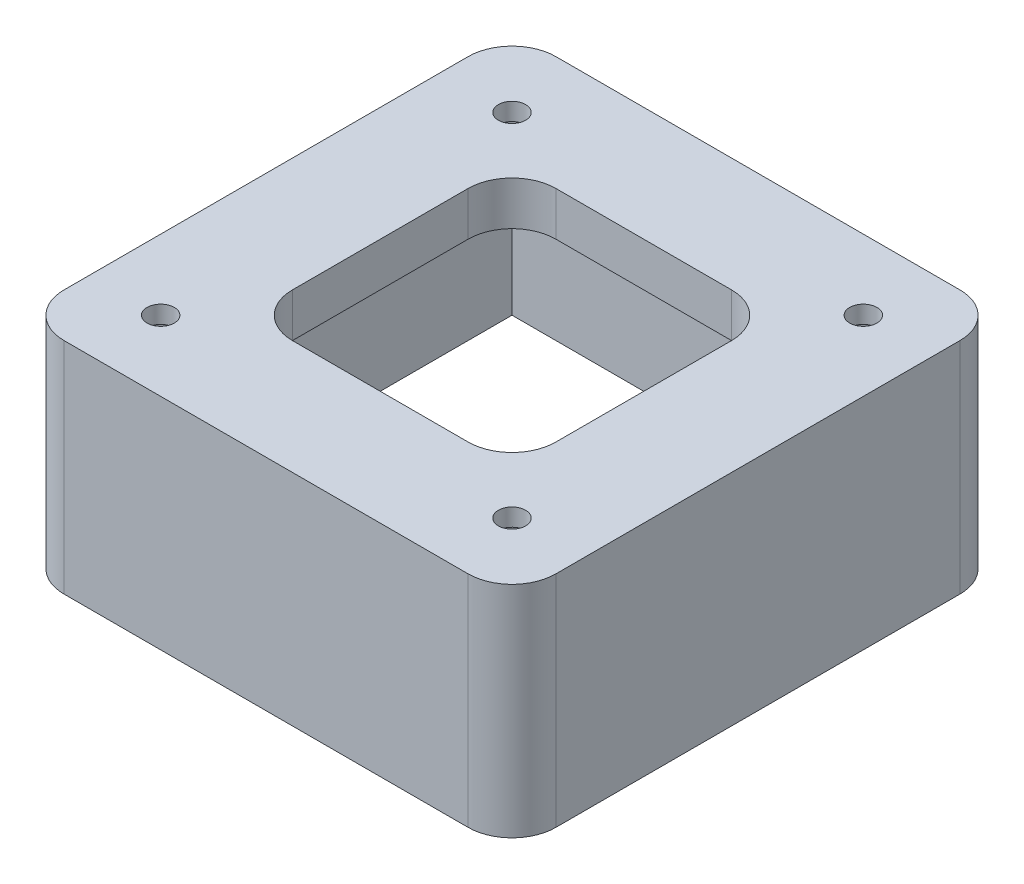
ISO-10303-21;
HEADER;
FILE_DESCRIPTION(('STEP AP214'),'2;1');
FILE_NAME('part.step','',(''),(''),'','','');
FILE_SCHEMA(('AUTOMOTIVE_DESIGN { 1 0 10303 214 1 1 1 1 }'));
ENDSEC;
DATA;
#1=APPLICATION_CONTEXT('core data for automotive mechanical design processes');
#2=APPLICATION_PROTOCOL_DEFINITION('international standard','automotive_design',2000,#1);
#3=PRODUCT_CONTEXT('',#1,'mechanical');
#4=PRODUCT('Part','Part','',(#3));
#5=PRODUCT_RELATED_PRODUCT_CATEGORY('part','',(#4));
#6=PRODUCT_DEFINITION_FORMATION('','',#4);
#7=PRODUCT_DEFINITION_CONTEXT('part definition',#1,'design');
#8=PRODUCT_DEFINITION('design','',#6,#7);
#9=PRODUCT_DEFINITION_SHAPE('','',#8);
#10=(LENGTH_UNIT() NAMED_UNIT(*) SI_UNIT(.MILLI.,.METRE.));
#11=(NAMED_UNIT(*) PLANE_ANGLE_UNIT() SI_UNIT($,.RADIAN.));
#12=(NAMED_UNIT(*) SI_UNIT($,.STERADIAN.) SOLID_ANGLE_UNIT());
#13=UNCERTAINTY_MEASURE_WITH_UNIT(LENGTH_MEASURE(1.E-05),#10,'distance_accuracy_value','');
#14=(GEOMETRIC_REPRESENTATION_CONTEXT(3) GLOBAL_UNCERTAINTY_ASSIGNED_CONTEXT((#13)) GLOBAL_UNIT_ASSIGNED_CONTEXT((#10,
#11,#12)) REPRESENTATION_CONTEXT('',''));
#15=CARTESIAN_POINT('',(0.,0.,0.));
#16=DIRECTION('',(0.,0.,1.));
#17=DIRECTION('',(1.,0.,0.));
#18=AXIS2_PLACEMENT_3D('',#15,#16,#17);
#19=CARTESIAN_POINT('',(-20.,5.,20.));
#20=DIRECTION('',(0.,-1.,0.));
#21=DIRECTION('',(0.,0.,-1.));
#22=AXIS2_PLACEMENT_3D('',#19,#20,#21);
#23=CYLINDRICAL_SURFACE('',#22,1.55);
#24=CARTESIAN_POINT('',(-20.,5.,20.));
#25=DIRECTION('',(0.,1.,0.));
#26=DIRECTION('',(0.,0.,1.));
#27=AXIS2_PLACEMENT_3D('',#24,#25,#26);
#28=CIRCLE('',#27,1.55);
#29=CARTESIAN_POINT('',(-20.,5.,21.55));
#30=VERTEX_POINT('',#29);
#31=EDGE_CURVE('E267',#30,#30,#28,.T.);
#32=ORIENTED_EDGE('',*,*,#31,.T.);
#33=EDGE_LOOP('',(#32));
#34=FACE_BOUND('',#33,.T.);
#35=CARTESIAN_POINT('',(-20.,3.,20.));
#36=DIRECTION('',(0.,-1.,0.));
#37=DIRECTION('',(0.,0.,-1.));
#38=AXIS2_PLACEMENT_3D('',#35,#36,#37);
#39=CIRCLE('',#38,1.55);
#40=CARTESIAN_POINT('',(-20.,3.,18.45));
#41=VERTEX_POINT('',#40);
#42=EDGE_CURVE('E230',#41,#41,#39,.T.);
#43=ORIENTED_EDGE('',*,*,#42,.T.);
#44=EDGE_LOOP('',(#43));
#45=FACE_BOUND('',#44,.T.);
#46=ADVANCED_FACE('F33',(#34,#45),#23,.F.);
#47=CARTESIAN_POINT('',(20.,5.,-20.));
#48=DIRECTION('',(0.,-1.,0.));
#49=DIRECTION('',(0.,0.,-1.));
#50=AXIS2_PLACEMENT_3D('',#47,#48,#49);
#51=CYLINDRICAL_SURFACE('',#50,1.55);
#52=CARTESIAN_POINT('',(20.,5.,-20.));
#53=DIRECTION('',(0.,1.,0.));
#54=DIRECTION('',(0.,0.,1.));
#55=AXIS2_PLACEMENT_3D('',#52,#53,#54);
#56=CIRCLE('',#55,1.55);
#57=CARTESIAN_POINT('',(20.,5.,-18.45));
#58=VERTEX_POINT('',#57);
#59=EDGE_CURVE('E284',#58,#58,#56,.T.);
#60=ORIENTED_EDGE('',*,*,#59,.T.);
#61=EDGE_LOOP('',(#60));
#62=FACE_BOUND('',#61,.T.);
#63=CARTESIAN_POINT('',(20.,3.,-20.));
#64=DIRECTION('',(0.,-1.,0.));
#65=DIRECTION('',(0.,0.,-1.));
#66=AXIS2_PLACEMENT_3D('',#63,#64,#65);
#67=CIRCLE('',#66,1.55);
#68=CARTESIAN_POINT('',(20.,3.,-21.55));
#69=VERTEX_POINT('',#68);
#70=EDGE_CURVE('E236',#69,#69,#67,.T.);
#71=ORIENTED_EDGE('',*,*,#70,.T.);
#72=EDGE_LOOP('',(#71));
#73=FACE_BOUND('',#72,.T.);
#74=ADVANCED_FACE('F412',(#62,#73),#51,.F.);
#75=CARTESIAN_POINT('',(-20.,5.,-20.));
#76=DIRECTION('',(0.,-1.,0.));
#77=DIRECTION('',(0.,0.,-1.));
#78=AXIS2_PLACEMENT_3D('',#75,#76,#77);
#79=CYLINDRICAL_SURFACE('',#78,1.55);
#80=CARTESIAN_POINT('',(-20.,5.,-20.));
#81=DIRECTION('',(0.,1.,0.));
#82=DIRECTION('',(0.,0.,1.));
#83=AXIS2_PLACEMENT_3D('',#80,#81,#82);
#84=CIRCLE('',#83,1.55);
#85=CARTESIAN_POINT('',(-20.,5.,-18.45));
#86=VERTEX_POINT('',#85);
#87=EDGE_CURVE('E287',#86,#86,#84,.T.);
#88=ORIENTED_EDGE('',*,*,#87,.T.);
#89=EDGE_LOOP('',(#88));
#90=FACE_BOUND('',#89,.T.);
#91=CARTESIAN_POINT('',(-20.,3.,-20.));
#92=DIRECTION('',(0.,-1.,0.));
#93=DIRECTION('',(0.,0.,-1.));
#94=AXIS2_PLACEMENT_3D('',#91,#92,#93);
#95=CIRCLE('',#94,1.55);
#96=CARTESIAN_POINT('',(-20.,3.,-21.55));
#97=VERTEX_POINT('',#96);
#98=EDGE_CURVE('E243',#97,#97,#95,.T.);
#99=ORIENTED_EDGE('',*,*,#98,.T.);
#100=EDGE_LOOP('',(#99));
#101=FACE_BOUND('',#100,.T.);
#102=ADVANCED_FACE('F418',(#90,#101),#79,.F.);
#103=CARTESIAN_POINT('',(20.,5.,20.));
#104=DIRECTION('',(0.,-1.,0.));
#105=DIRECTION('',(0.,0.,-1.));
#106=AXIS2_PLACEMENT_3D('',#103,#104,#105);
#107=CYLINDRICAL_SURFACE('',#106,1.55);
#108=CARTESIAN_POINT('',(20.,5.,20.));
#109=DIRECTION('',(0.,1.,0.));
#110=DIRECTION('',(0.,0.,1.));
#111=AXIS2_PLACEMENT_3D('',#108,#109,#110);
#112=CIRCLE('',#111,1.55);
#113=CARTESIAN_POINT('',(20.,5.,21.55));
#114=VERTEX_POINT('',#113);
#115=EDGE_CURVE('E281',#114,#114,#112,.T.);
#116=ORIENTED_EDGE('',*,*,#115,.T.);
#117=EDGE_LOOP('',(#116));
#118=FACE_BOUND('',#117,.T.);
#119=CARTESIAN_POINT('',(20.,3.,20.));
#120=DIRECTION('',(0.,-1.,0.));
#121=DIRECTION('',(0.,0.,-1.));
#122=AXIS2_PLACEMENT_3D('',#119,#120,#121);
#123=CIRCLE('',#122,1.55);
#124=CARTESIAN_POINT('',(20.,3.,18.45));
#125=VERTEX_POINT('',#124);
#126=EDGE_CURVE('E250',#125,#125,#123,.T.);
#127=ORIENTED_EDGE('',*,*,#126,.T.);
#128=EDGE_LOOP('',(#127));
#129=FACE_BOUND('',#128,.T.);
#130=ADVANCED_FACE('F426',(#118,#129),#107,.F.);
#131=CARTESIAN_POINT('',(0.,5.,0.));
#132=DIRECTION('',(0.,1.,0.));
#133=DIRECTION('',(0.,0.,1.));
#134=AXIS2_PLACEMENT_3D('',#131,#132,#133);
#135=PLANE('',#134);
#136=ORIENTED_EDGE('',*,*,#115,.F.);
#137=EDGE_LOOP('',(#136));
#138=FACE_BOUND('',#137,.T.);
#139=ORIENTED_EDGE('',*,*,#87,.F.);
#140=EDGE_LOOP('',(#139));
#141=FACE_BOUND('',#140,.T.);
#142=DIRECTION('',(1.,0.,0.));
#143=VECTOR('',#142,1.);
#144=CARTESIAN_POINT('',(28.,5.,28.));
#145=LINE('',#144,#143);
#146=CARTESIAN_POINT('',(-23.,5.,28.));
#147=VERTEX_POINT('',#146);
#148=CARTESIAN_POINT('',(23.,5.,28.));
#149=VERTEX_POINT('',#148);
#150=EDGE_CURVE('E293',#147,#149,#145,.T.);
#151=ORIENTED_EDGE('',*,*,#150,.T.);
#152=CARTESIAN_POINT('',(23.,5.,23.));
#153=DIRECTION('',(0.,1.,0.));
#154=DIRECTION('',(0.,0.,1.));
#155=AXIS2_PLACEMENT_3D('',#152,#153,#154);
#156=CIRCLE('',#155,5.);
#157=CARTESIAN_POINT('',(28.,5.,23.));
#158=VERTEX_POINT('',#157);
#159=EDGE_CURVE('E367',#149,#158,#156,.T.);
#160=ORIENTED_EDGE('',*,*,#159,.T.);
#161=DIRECTION('',(0.,0.,-1.));
#162=VECTOR('',#161,1.);
#163=CARTESIAN_POINT('',(28.,5.,28.));
#164=LINE('',#163,#162);
#165=CARTESIAN_POINT('',(28.,5.,-23.));
#166=VERTEX_POINT('',#165);
#167=EDGE_CURVE('E296',#158,#166,#164,.T.);
#168=ORIENTED_EDGE('',*,*,#167,.T.);
#169=CARTESIAN_POINT('',(23.,5.,-23.));
#170=DIRECTION('',(0.,1.,0.));
#171=DIRECTION('',(0.,0.,1.));
#172=AXIS2_PLACEMENT_3D('',#169,#170,#171);
#173=CIRCLE('',#172,5.);
#174=CARTESIAN_POINT('',(23.,5.,-28.));
#175=VERTEX_POINT('',#174);
#176=EDGE_CURVE('E55',#166,#175,#173,.T.);
#177=ORIENTED_EDGE('',*,*,#176,.T.);
#178=DIRECTION('',(-1.,0.,0.));
#179=VECTOR('',#178,1.);
#180=CARTESIAN_POINT('',(28.,5.,-28.));
#181=LINE('',#180,#179);
#182=CARTESIAN_POINT('',(-23.,5.,-28.));
#183=VERTEX_POINT('',#182);
#184=EDGE_CURVE('E298',#175,#183,#181,.T.);
#185=ORIENTED_EDGE('',*,*,#184,.T.);
#186=CARTESIAN_POINT('',(-23.,5.,-23.));
#187=DIRECTION('',(0.,1.,0.));
#188=DIRECTION('',(0.,0.,1.));
#189=AXIS2_PLACEMENT_3D('',#186,#187,#188);
#190=CIRCLE('',#189,5.);
#191=CARTESIAN_POINT('',(-28.,5.,-23.));
#192=VERTEX_POINT('',#191);
#193=EDGE_CURVE('E364',#183,#192,#190,.T.);
#194=ORIENTED_EDGE('',*,*,#193,.T.);
#195=DIRECTION('',(0.,0.,1.));
#196=VECTOR('',#195,1.);
#197=CARTESIAN_POINT('',(-28.,5.,28.));
#198=LINE('',#197,#196);
#199=CARTESIAN_POINT('',(-28.,5.,23.));
#200=VERTEX_POINT('',#199);
#201=EDGE_CURVE('E290',#192,#200,#198,.T.);
#202=ORIENTED_EDGE('',*,*,#201,.T.);
#203=CARTESIAN_POINT('',(-23.,5.,23.));
#204=DIRECTION('',(0.,1.,0.));
#205=DIRECTION('',(0.,0.,1.));
#206=AXIS2_PLACEMENT_3D('',#203,#204,#205);
#207=CIRCLE('',#206,5.);
#208=EDGE_CURVE('E362',#200,#147,#207,.T.);
#209=ORIENTED_EDGE('',*,*,#208,.T.);
#210=EDGE_LOOP('',(#151,#160,#168,#177,#185,#194,#202,#209));
#211=FACE_BOUND('',#210,.T.);
#212=ORIENTED_EDGE('',*,*,#59,.F.);
#213=EDGE_LOOP('',(#212));
#214=FACE_BOUND('',#213,.T.);
#215=ORIENTED_EDGE('',*,*,#31,.F.);
#216=EDGE_LOOP('',(#215));
#217=FACE_BOUND('',#216,.T.);
#218=DIRECTION('',(-1.,0.,0.));
#219=VECTOR('',#218,1.);
#220=CARTESIAN_POINT('',(-15.,5.,-15.));
#221=LINE('',#220,#219);
#222=CARTESIAN_POINT('',(10.,5.,-15.));
#223=VERTEX_POINT('',#222);
#224=CARTESIAN_POINT('',(-10.,5.,-15.));
#225=VERTEX_POINT('',#224);
#226=EDGE_CURVE('E257',#223,#225,#221,.T.);
#227=ORIENTED_EDGE('',*,*,#226,.F.);
#228=CARTESIAN_POINT('',(10.,5.,-10.));
#229=DIRECTION('',(0.,1.,0.));
#230=DIRECTION('',(0.,0.,1.));
#231=AXIS2_PLACEMENT_3D('',#228,#229,#230);
#232=CIRCLE('',#231,5.);
#233=CARTESIAN_POINT('',(15.,5.,-10.));
#234=VERTEX_POINT('',#233);
#235=EDGE_CURVE('E334',#223,#234,#232,.F.);
#236=ORIENTED_EDGE('',*,*,#235,.T.);
#237=DIRECTION('',(0.,0.,-1.));
#238=VECTOR('',#237,1.);
#239=CARTESIAN_POINT('',(15.,5.,15.));
#240=LINE('',#239,#238);
#241=CARTESIAN_POINT('',(15.,5.,9.99999999999999));
#242=VERTEX_POINT('',#241);
#243=EDGE_CURVE('E254',#242,#234,#240,.T.);
#244=ORIENTED_EDGE('',*,*,#243,.F.);
#245=CARTESIAN_POINT('',(10.,5.,9.99999999999999));
#246=DIRECTION('',(0.,1.,0.));
#247=DIRECTION('',(0.,0.,1.));
#248=AXIS2_PLACEMENT_3D('',#245,#246,#247);
#249=CIRCLE('',#248,5.);
#250=CARTESIAN_POINT('',(10.,5.,15.));
#251=VERTEX_POINT('',#250);
#252=EDGE_CURVE('E338',#242,#251,#249,.F.);
#253=ORIENTED_EDGE('',*,*,#252,.T.);
#254=DIRECTION('',(1.,0.,0.));
#255=VECTOR('',#254,1.);
#256=CARTESIAN_POINT('',(-15.,5.,15.));
#257=LINE('',#256,#255);
#258=CARTESIAN_POINT('',(-10.,5.,15.));
#259=VERTEX_POINT('',#258);
#260=EDGE_CURVE('E264',#259,#251,#257,.T.);
#261=ORIENTED_EDGE('',*,*,#260,.F.);
#262=CARTESIAN_POINT('',(-10.,5.,9.99999999999999));
#263=DIRECTION('',(0.,1.,0.));
#264=DIRECTION('',(0.,0.,1.));
#265=AXIS2_PLACEMENT_3D('',#262,#263,#264);
#266=CIRCLE('',#265,5.);
#267=CARTESIAN_POINT('',(-15.,5.,9.99999999999999));
#268=VERTEX_POINT('',#267);
#269=EDGE_CURVE('E342',#259,#268,#266,.F.);
#270=ORIENTED_EDGE('',*,*,#269,.T.);
#271=DIRECTION('',(0.,0.,1.));
#272=VECTOR('',#271,1.);
#273=CARTESIAN_POINT('',(-15.,5.,15.));
#274=LINE('',#273,#272);
#275=CARTESIAN_POINT('',(-15.,5.,-10.));
#276=VERTEX_POINT('',#275);
#277=EDGE_CURVE('E261',#276,#268,#274,.T.);
#278=ORIENTED_EDGE('',*,*,#277,.F.);
#279=CARTESIAN_POINT('',(-10.,5.,-10.));
#280=DIRECTION('',(0.,1.,0.));
#281=DIRECTION('',(0.,0.,1.));
#282=AXIS2_PLACEMENT_3D('',#279,#280,#281);
#283=CIRCLE('',#282,5.);
#284=EDGE_CURVE('E330',#276,#225,#283,.F.);
#285=ORIENTED_EDGE('',*,*,#284,.T.);
#286=EDGE_LOOP('',(#227,#236,#244,#253,#261,#270,#278,#285));
#287=FACE_BOUND('',#286,.T.);
#288=ADVANCED_FACE('F380',(#138,#141,#211,#214,#217,#287),#135,.T.);
#289=CARTESIAN_POINT('',(0.,0.,0.));
#290=DIRECTION('',(0.,1.,0.));
#291=DIRECTION('',(0.,0.,1.));
#292=AXIS2_PLACEMENT_3D('',#289,#290,#291);
#293=PLANE('',#292);
#294=DIRECTION('',(0.,0.,1.));
#295=VECTOR('',#294,1.);
#296=CARTESIAN_POINT('',(25.,0.,-25.));
#297=LINE('',#296,#295);
#298=CARTESIAN_POINT('',(25.,0.,-25.));
#299=VERTEX_POINT('',#298);
#300=CARTESIAN_POINT('',(25.,0.,25.));
#301=VERTEX_POINT('',#300);
#302=EDGE_CURVE('E184',#299,#301,#297,.T.);
#303=ORIENTED_EDGE('',*,*,#302,.T.);
#304=DIRECTION('',(-1.,0.,0.));
#305=VECTOR('',#304,1.);
#306=CARTESIAN_POINT('',(25.,0.,25.));
#307=LINE('',#306,#305);
#308=CARTESIAN_POINT('',(-25.,0.,25.));
#309=VERTEX_POINT('',#308);
#310=EDGE_CURVE('E203',#301,#309,#307,.T.);
#311=ORIENTED_EDGE('',*,*,#310,.T.);
#312=DIRECTION('',(0.,0.,-1.));
#313=VECTOR('',#312,1.);
#314=CARTESIAN_POINT('',(-25.,0.,25.));
#315=LINE('',#314,#313);
#316=CARTESIAN_POINT('',(-25.,0.,-25.));
#317=VERTEX_POINT('',#316);
#318=EDGE_CURVE('E190',#309,#317,#315,.T.);
#319=ORIENTED_EDGE('',*,*,#318,.T.);
#320=DIRECTION('',(1.,0.,0.));
#321=VECTOR('',#320,1.);
#322=CARTESIAN_POINT('',(-25.,0.,-25.));
#323=LINE('',#322,#321);
#324=EDGE_CURVE('E206',#317,#299,#323,.T.);
#325=ORIENTED_EDGE('',*,*,#324,.T.);
#326=EDGE_LOOP('',(#303,#311,#319,#325));
#327=FACE_BOUND('',#326,.T.);
#328=CARTESIAN_POINT('',(-20.,0.,20.));
#329=DIRECTION('',(0.,-1.,0.));
#330=DIRECTION('',(0.,0.,-1.));
#331=AXIS2_PLACEMENT_3D('',#328,#329,#330);
#332=CIRCLE('',#331,3.55);
#333=CARTESIAN_POINT('',(-20.,0.,16.45));
#334=VERTEX_POINT('',#333);
#335=EDGE_CURVE('E226',#334,#334,#332,.T.);
#336=ORIENTED_EDGE('',*,*,#335,.F.);
#337=EDGE_LOOP('',(#336));
#338=FACE_BOUND('',#337,.T.);
#339=CARTESIAN_POINT('',(20.,0.,-20.));
#340=DIRECTION('',(0.,-1.,0.));
#341=DIRECTION('',(0.,0.,-1.));
#342=AXIS2_PLACEMENT_3D('',#339,#340,#341);
#343=CIRCLE('',#342,3.55);
#344=CARTESIAN_POINT('',(20.,0.,-23.55));
#345=VERTEX_POINT('',#344);
#346=EDGE_CURVE('E237',#345,#345,#343,.T.);
#347=ORIENTED_EDGE('',*,*,#346,.F.);
#348=EDGE_LOOP('',(#347));
#349=FACE_BOUND('',#348,.T.);
#350=CARTESIAN_POINT('',(-20.,0.,-20.));
#351=DIRECTION('',(0.,-1.,0.));
#352=DIRECTION('',(0.,0.,-1.));
#353=AXIS2_PLACEMENT_3D('',#350,#351,#352);
#354=CIRCLE('',#353,3.55);
#355=CARTESIAN_POINT('',(-20.,0.,-23.55));
#356=VERTEX_POINT('',#355);
#357=EDGE_CURVE('E244',#356,#356,#354,.T.);
#358=ORIENTED_EDGE('',*,*,#357,.F.);
#359=EDGE_LOOP('',(#358));
#360=FACE_BOUND('',#359,.T.);
#361=CARTESIAN_POINT('',(20.,0.,20.));
#362=DIRECTION('',(0.,-1.,0.));
#363=DIRECTION('',(0.,0.,-1.));
#364=AXIS2_PLACEMENT_3D('',#361,#362,#363);
#365=CIRCLE('',#364,3.55);
#366=CARTESIAN_POINT('',(20.,0.,16.45));
#367=VERTEX_POINT('',#366);
#368=EDGE_CURVE('E251',#367,#367,#365,.T.);
#369=ORIENTED_EDGE('',*,*,#368,.F.);
#370=EDGE_LOOP('',(#369));
#371=FACE_BOUND('',#370,.T.);
#372=DIRECTION('',(1.,0.,0.));
#373=VECTOR('',#372,1.);
#374=CARTESIAN_POINT('',(-15.,0.,15.));
#375=LINE('',#374,#373);
#376=CARTESIAN_POINT('',(-10.,0.,15.));
#377=VERTEX_POINT('',#376);
#378=CARTESIAN_POINT('',(10.,0.,15.));
#379=VERTEX_POINT('',#378);
#380=EDGE_CURVE('E258',#377,#379,#375,.T.);
#381=ORIENTED_EDGE('',*,*,#380,.T.);
#382=CARTESIAN_POINT('',(10.,0.,9.99999999999999));
#383=DIRECTION('',(0.,1.,0.));
#384=DIRECTION('',(0.,0.,1.));
#385=AXIS2_PLACEMENT_3D('',#382,#383,#384);
#386=CIRCLE('',#385,5.);
#387=CARTESIAN_POINT('',(15.,0.,9.99999999999999));
#388=VERTEX_POINT('',#387);
#389=EDGE_CURVE('E336',#379,#388,#386,.T.);
#390=ORIENTED_EDGE('',*,*,#389,.T.);
#391=DIRECTION('',(0.,0.,-1.));
#392=VECTOR('',#391,1.);
#393=CARTESIAN_POINT('',(15.,0.,15.));
#394=LINE('',#393,#392);
#395=CARTESIAN_POINT('',(15.,0.,-10.));
#396=VERTEX_POINT('',#395);
#397=EDGE_CURVE('E268',#388,#396,#394,.T.);
#398=ORIENTED_EDGE('',*,*,#397,.T.);
#399=CARTESIAN_POINT('',(10.,0.,-10.));
#400=DIRECTION('',(0.,1.,0.));
#401=DIRECTION('',(0.,0.,1.));
#402=AXIS2_PLACEMENT_3D('',#399,#400,#401);
#403=CIRCLE('',#402,5.);
#404=CARTESIAN_POINT('',(10.,0.,-15.));
#405=VERTEX_POINT('',#404);
#406=EDGE_CURVE('E332',#396,#405,#403,.T.);
#407=ORIENTED_EDGE('',*,*,#406,.T.);
#408=DIRECTION('',(-1.,0.,0.));
#409=VECTOR('',#408,1.);
#410=CARTESIAN_POINT('',(-15.,0.,-15.));
#411=LINE('',#410,#409);
#412=CARTESIAN_POINT('',(-10.,0.,-15.));
#413=VERTEX_POINT('',#412);
#414=EDGE_CURVE('E271',#405,#413,#411,.T.);
#415=ORIENTED_EDGE('',*,*,#414,.T.);
#416=CARTESIAN_POINT('',(-10.,0.,-10.));
#417=DIRECTION('',(0.,1.,0.));
#418=DIRECTION('',(0.,0.,1.));
#419=AXIS2_PLACEMENT_3D('',#416,#417,#418);
#420=CIRCLE('',#419,5.);
#421=CARTESIAN_POINT('',(-15.,0.,-10.));
#422=VERTEX_POINT('',#421);
#423=EDGE_CURVE('E328',#413,#422,#420,.T.);
#424=ORIENTED_EDGE('',*,*,#423,.T.);
#425=DIRECTION('',(0.,0.,1.));
#426=VECTOR('',#425,1.);
#427=CARTESIAN_POINT('',(-15.,0.,15.));
#428=LINE('',#427,#426);
#429=CARTESIAN_POINT('',(-15.,0.,9.99999999999999));
#430=VERTEX_POINT('',#429);
#431=EDGE_CURVE('E274',#422,#430,#428,.T.);
#432=ORIENTED_EDGE('',*,*,#431,.T.);
#433=CARTESIAN_POINT('',(-10.,0.,9.99999999999999));
#434=DIRECTION('',(0.,1.,0.));
#435=DIRECTION('',(0.,0.,1.));
#436=AXIS2_PLACEMENT_3D('',#433,#434,#435);
#437=CIRCLE('',#436,5.);
#438=EDGE_CURVE('E340',#430,#377,#437,.T.);
#439=ORIENTED_EDGE('',*,*,#438,.T.);
#440=EDGE_LOOP('',(#381,#390,#398,#407,#415,#424,#432,#439));
#441=FACE_BOUND('',#440,.T.);
#442=ADVANCED_FACE('F435',(#327,#338,#349,#360,#371,#441),#293,.F.);
#443=CARTESIAN_POINT('',(-28.,5.,28.));
#444=DIRECTION('',(1.,0.,0.));
#445=DIRECTION('',(0.,0.,-1.));
#446=AXIS2_PLACEMENT_3D('',#443,#444,#445);
#447=PLANE('',#446);
#448=ORIENTED_EDGE('',*,*,#201,.F.);
#449=DIRECTION('',(0.,-1.,0.));
#450=VECTOR('',#449,1.);
#451=CARTESIAN_POINT('',(-28.,5.,-23.));
#452=LINE('',#451,#450);
#453=CARTESIAN_POINT('',(-28.,-20.,-23.));
#454=VERTEX_POINT('',#453);
#455=EDGE_CURVE('E11',#192,#454,#452,.T.);
#456=ORIENTED_EDGE('',*,*,#455,.T.);
#457=DIRECTION('',(0.,0.,-1.));
#458=VECTOR('',#457,1.);
#459=CARTESIAN_POINT('',(-28.,-20.,28.));
#460=LINE('',#459,#458);
#461=CARTESIAN_POINT('',(-28.,-20.,23.));
#462=VERTEX_POINT('',#461);
#463=EDGE_CURVE('E217',#462,#454,#460,.T.);
#464=ORIENTED_EDGE('',*,*,#463,.F.);
#465=DIRECTION('',(0.,-1.,0.));
#466=VECTOR('',#465,1.);
#467=CARTESIAN_POINT('',(-28.,5.,23.));
#468=LINE('',#467,#466);
#469=EDGE_CURVE('E41',#462,#200,#468,.F.);
#470=ORIENTED_EDGE('',*,*,#469,.T.);
#471=EDGE_LOOP('',(#448,#456,#464,#470));
#472=FACE_BOUND('',#471,.T.);
#473=ADVANCED_FACE('F376',(#472),#447,.F.);
#474=CARTESIAN_POINT('',(28.,5.,28.));
#475=DIRECTION('',(0.,0.,-1.));
#476=DIRECTION('',(-1.,0.,0.));
#477=AXIS2_PLACEMENT_3D('',#474,#475,#476);
#478=PLANE('',#477);
#479=DIRECTION('',(-1.,0.,0.));
#480=VECTOR('',#479,1.);
#481=CARTESIAN_POINT('',(28.,-20.,28.));
#482=LINE('',#481,#480);
#483=CARTESIAN_POINT('',(23.,-20.,28.));
#484=VERTEX_POINT('',#483);
#485=CARTESIAN_POINT('',(-23.,-20.,28.));
#486=VERTEX_POINT('',#485);
#487=EDGE_CURVE('E191',#484,#486,#482,.T.);
#488=ORIENTED_EDGE('',*,*,#487,.F.);
#489=DIRECTION('',(0.,-1.,0.));
#490=VECTOR('',#489,1.);
#491=CARTESIAN_POINT('',(23.,5.,28.));
#492=LINE('',#491,#490);
#493=EDGE_CURVE('E360',#484,#149,#492,.F.);
#494=ORIENTED_EDGE('',*,*,#493,.T.);
#495=ORIENTED_EDGE('',*,*,#150,.F.);
#496=DIRECTION('',(0.,-1.,0.));
#497=VECTOR('',#496,1.);
#498=CARTESIAN_POINT('',(-23.,5.,28.));
#499=LINE('',#498,#497);
#500=EDGE_CURVE('E357',#147,#486,#499,.T.);
#501=ORIENTED_EDGE('',*,*,#500,.T.);
#502=EDGE_LOOP('',(#488,#494,#495,#501));
#503=FACE_BOUND('',#502,.T.);
#504=ADVANCED_FACE('F387',(#503),#478,.F.);
#505=CARTESIAN_POINT('',(28.,5.,28.));
#506=DIRECTION('',(-1.,0.,0.));
#507=DIRECTION('',(0.,0.,1.));
#508=AXIS2_PLACEMENT_3D('',#505,#506,#507);
#509=PLANE('',#508);
#510=ORIENTED_EDGE('',*,*,#167,.F.);
#511=DIRECTION('',(0.,-1.,0.));
#512=VECTOR('',#511,1.);
#513=CARTESIAN_POINT('',(28.,5.,23.));
#514=LINE('',#513,#512);
#515=CARTESIAN_POINT('',(28.,-20.,23.));
#516=VERTEX_POINT('',#515);
#517=EDGE_CURVE('E346',#158,#516,#514,.T.);
#518=ORIENTED_EDGE('',*,*,#517,.T.);
#519=DIRECTION('',(0.,0.,1.));
#520=VECTOR('',#519,1.);
#521=CARTESIAN_POINT('',(28.,-20.,-28.));
#522=LINE('',#521,#520);
#523=CARTESIAN_POINT('',(28.,-20.,-23.));
#524=VERTEX_POINT('',#523);
#525=EDGE_CURVE('E223',#524,#516,#522,.T.);
#526=ORIENTED_EDGE('',*,*,#525,.F.);
#527=DIRECTION('',(0.,-1.,0.));
#528=VECTOR('',#527,1.);
#529=CARTESIAN_POINT('',(28.,5.,-23.));
#530=LINE('',#529,#528);
#531=EDGE_CURVE('E344',#524,#166,#530,.F.);
#532=ORIENTED_EDGE('',*,*,#531,.T.);
#533=EDGE_LOOP('',(#510,#518,#526,#532));
#534=FACE_BOUND('',#533,.T.);
#535=ADVANCED_FACE('F397',(#534),#509,.F.);
#536=CARTESIAN_POINT('',(28.,5.,-28.));
#537=DIRECTION('',(0.,0.,1.));
#538=DIRECTION('',(1.,0.,0.));
#539=AXIS2_PLACEMENT_3D('',#536,#537,#538);
#540=PLANE('',#539);
#541=ORIENTED_EDGE('',*,*,#184,.F.);
#542=DIRECTION('',(0.,-1.,0.));
#543=VECTOR('',#542,1.);
#544=CARTESIAN_POINT('',(23.,5.,-28.));
#545=LINE('',#544,#543);
#546=CARTESIAN_POINT('',(23.,-20.,-28.));
#547=VERTEX_POINT('',#546);
#548=EDGE_CURVE('E370',#175,#547,#545,.T.);
#549=ORIENTED_EDGE('',*,*,#548,.T.);
#550=DIRECTION('',(1.,0.,0.));
#551=VECTOR('',#550,1.);
#552=CARTESIAN_POINT('',(-28.,-20.,-28.));
#553=LINE('',#552,#551);
#554=CARTESIAN_POINT('',(-23.,-20.,-28.));
#555=VERTEX_POINT('',#554);
#556=EDGE_CURVE('E220',#555,#547,#553,.T.);
#557=ORIENTED_EDGE('',*,*,#556,.F.);
#558=DIRECTION('',(0.,-1.,0.));
#559=VECTOR('',#558,1.);
#560=CARTESIAN_POINT('',(-23.,5.,-28.));
#561=LINE('',#560,#559);
#562=EDGE_CURVE('E48',#555,#183,#561,.F.);
#563=ORIENTED_EDGE('',*,*,#562,.T.);
#564=EDGE_LOOP('',(#541,#549,#557,#563));
#565=FACE_BOUND('',#564,.T.);
#566=ADVANCED_FACE('F402',(#565),#540,.F.);
#567=CARTESIAN_POINT('',(15.,5.,15.));
#568=DIRECTION('',(-1.,0.,0.));
#569=DIRECTION('',(0.,0.,1.));
#570=AXIS2_PLACEMENT_3D('',#567,#568,#569);
#571=PLANE('',#570);
#572=ORIENTED_EDGE('',*,*,#243,.T.);
#573=DIRECTION('',(0.,-1.,0.));
#574=VECTOR('',#573,1.);
#575=CARTESIAN_POINT('',(15.,0.,-10.));
#576=LINE('',#575,#574);
#577=EDGE_CURVE('E320',#234,#396,#576,.T.);
#578=ORIENTED_EDGE('',*,*,#577,.T.);
#579=ORIENTED_EDGE('',*,*,#397,.F.);
#580=DIRECTION('',(0.,-1.,0.));
#581=VECTOR('',#580,1.);
#582=CARTESIAN_POINT('',(15.,5.,9.99999999999999));
#583=LINE('',#582,#581);
#584=EDGE_CURVE('E318',#388,#242,#583,.F.);
#585=ORIENTED_EDGE('',*,*,#584,.T.);
#586=EDGE_LOOP('',(#572,#578,#579,#585));
#587=FACE_BOUND('',#586,.T.);
#588=ADVANCED_FACE('F424',(#587),#571,.T.);
#589=CARTESIAN_POINT('',(-15.,5.,-15.));
#590=DIRECTION('',(0.,0.,1.));
#591=DIRECTION('',(1.,0.,0.));
#592=AXIS2_PLACEMENT_3D('',#589,#590,#591);
#593=PLANE('',#592);
#594=ORIENTED_EDGE('',*,*,#226,.T.);
#595=DIRECTION('',(0.,-1.,0.));
#596=VECTOR('',#595,1.);
#597=CARTESIAN_POINT('',(-10.,0.,-15.));
#598=LINE('',#597,#596);
#599=EDGE_CURVE('E310',#225,#413,#598,.T.);
#600=ORIENTED_EDGE('',*,*,#599,.T.);
#601=ORIENTED_EDGE('',*,*,#414,.F.);
#602=DIRECTION('',(0.,-1.,0.));
#603=VECTOR('',#602,1.);
#604=CARTESIAN_POINT('',(10.,5.,-15.));
#605=LINE('',#604,#603);
#606=EDGE_CURVE('E300',#405,#223,#605,.F.);
#607=ORIENTED_EDGE('',*,*,#606,.T.);
#608=EDGE_LOOP('',(#594,#600,#601,#607));
#609=FACE_BOUND('',#608,.T.);
#610=ADVANCED_FACE('F523',(#609),#593,.T.);
#611=CARTESIAN_POINT('',(-15.,5.,15.));
#612=DIRECTION('',(1.,0.,0.));
#613=DIRECTION('',(0.,0.,-1.));
#614=AXIS2_PLACEMENT_3D('',#611,#612,#613);
#615=PLANE('',#614);
#616=ORIENTED_EDGE('',*,*,#431,.F.);
#617=DIRECTION('',(0.,-1.,0.));
#618=VECTOR('',#617,1.);
#619=CARTESIAN_POINT('',(-15.,5.,-10.));
#620=LINE('',#619,#618);
#621=EDGE_CURVE('E316',#422,#276,#620,.F.);
#622=ORIENTED_EDGE('',*,*,#621,.T.);
#623=ORIENTED_EDGE('',*,*,#277,.T.);
#624=DIRECTION('',(0.,-1.,0.));
#625=VECTOR('',#624,1.);
#626=CARTESIAN_POINT('',(-15.,0.,9.99999999999999));
#627=LINE('',#626,#625);
#628=EDGE_CURVE('E313',#268,#430,#627,.T.);
#629=ORIENTED_EDGE('',*,*,#628,.T.);
#630=EDGE_LOOP('',(#616,#622,#623,#629));
#631=FACE_BOUND('',#630,.T.);
#632=ADVANCED_FACE('F520',(#631),#615,.T.);
#633=CARTESIAN_POINT('',(-15.,5.,15.));
#634=DIRECTION('',(0.,0.,-1.));
#635=DIRECTION('',(-1.,0.,0.));
#636=AXIS2_PLACEMENT_3D('',#633,#634,#635);
#637=PLANE('',#636);
#638=ORIENTED_EDGE('',*,*,#260,.T.);
#639=DIRECTION('',(0.,-1.,0.));
#640=VECTOR('',#639,1.);
#641=CARTESIAN_POINT('',(10.,0.,15.));
#642=LINE('',#641,#640);
#643=EDGE_CURVE('E325',#251,#379,#642,.T.);
#644=ORIENTED_EDGE('',*,*,#643,.T.);
#645=ORIENTED_EDGE('',*,*,#380,.F.);
#646=DIRECTION('',(0.,-1.,0.));
#647=VECTOR('',#646,1.);
#648=CARTESIAN_POINT('',(-10.,5.,15.));
#649=LINE('',#648,#647);
#650=EDGE_CURVE('E323',#377,#259,#649,.F.);
#651=ORIENTED_EDGE('',*,*,#650,.T.);
#652=EDGE_LOOP('',(#638,#644,#645,#651));
#653=FACE_BOUND('',#652,.T.);
#654=ADVANCED_FACE('F516',(#653),#637,.T.);
#655=CARTESIAN_POINT('',(20.,3.,20.));
#656=DIRECTION('',(0.,-1.,0.));
#657=DIRECTION('',(0.,0.,-1.));
#658=AXIS2_PLACEMENT_3D('',#655,#656,#657);
#659=CYLINDRICAL_SURFACE('',#658,3.55);
#660=CARTESIAN_POINT('',(20.,3.,20.));
#661=DIRECTION('',(0.,-1.,0.));
#662=DIRECTION('',(0.,0.,-1.));
#663=AXIS2_PLACEMENT_3D('',#660,#661,#662);
#664=CIRCLE('',#663,3.55);
#665=CARTESIAN_POINT('',(20.,3.,16.45));
#666=VERTEX_POINT('',#665);
#667=EDGE_CURVE('E247',#666,#666,#664,.T.);
#668=ORIENTED_EDGE('',*,*,#667,.F.);
#669=EDGE_LOOP('',(#668));
#670=FACE_BOUND('',#669,.T.);
#671=ORIENTED_EDGE('',*,*,#368,.T.);
#672=EDGE_LOOP('',(#671));
#673=FACE_BOUND('',#672,.T.);
#674=ADVANCED_FACE('F512',(#670,#673),#659,.F.);
#675=CARTESIAN_POINT('',(20.,3.,20.));
#676=DIRECTION('',(0.,-1.,0.));
#677=DIRECTION('',(0.,0.,-1.));
#678=AXIS2_PLACEMENT_3D('',#675,#676,#677);
#679=PLANE('',#678);
#680=ORIENTED_EDGE('',*,*,#126,.F.);
#681=EDGE_LOOP('',(#680));
#682=FACE_BOUND('',#681,.T.);
#683=ORIENTED_EDGE('',*,*,#667,.T.);
#684=EDGE_LOOP('',(#683));
#685=FACE_BOUND('',#684,.T.);
#686=ADVANCED_FACE('F508',(#682,#685),#679,.T.);
#687=CARTESIAN_POINT('',(-20.,3.,-20.));
#688=DIRECTION('',(0.,-1.,0.));
#689=DIRECTION('',(0.,0.,-1.));
#690=AXIS2_PLACEMENT_3D('',#687,#688,#689);
#691=CYLINDRICAL_SURFACE('',#690,3.55);
#692=CARTESIAN_POINT('',(-20.,3.,-20.));
#693=DIRECTION('',(0.,-1.,0.));
#694=DIRECTION('',(0.,0.,-1.));
#695=AXIS2_PLACEMENT_3D('',#692,#693,#694);
#696=CIRCLE('',#695,3.55);
#697=CARTESIAN_POINT('',(-20.,3.,-23.55));
#698=VERTEX_POINT('',#697);
#699=EDGE_CURVE('E240',#698,#698,#696,.T.);
#700=ORIENTED_EDGE('',*,*,#699,.F.);
#701=EDGE_LOOP('',(#700));
#702=FACE_BOUND('',#701,.T.);
#703=ORIENTED_EDGE('',*,*,#357,.T.);
#704=EDGE_LOOP('',(#703));
#705=FACE_BOUND('',#704,.T.);
#706=ADVANCED_FACE('F504',(#702,#705),#691,.F.);
#707=CARTESIAN_POINT('',(-20.,3.,-20.));
#708=DIRECTION('',(0.,-1.,0.));
#709=DIRECTION('',(0.,0.,-1.));
#710=AXIS2_PLACEMENT_3D('',#707,#708,#709);
#711=PLANE('',#710);
#712=ORIENTED_EDGE('',*,*,#98,.F.);
#713=EDGE_LOOP('',(#712));
#714=FACE_BOUND('',#713,.T.);
#715=ORIENTED_EDGE('',*,*,#699,.T.);
#716=EDGE_LOOP('',(#715));
#717=FACE_BOUND('',#716,.T.);
#718=ADVANCED_FACE('F500',(#714,#717),#711,.T.);
#719=CARTESIAN_POINT('',(20.,3.,-20.));
#720=DIRECTION('',(0.,-1.,0.));
#721=DIRECTION('',(0.,0.,-1.));
#722=AXIS2_PLACEMENT_3D('',#719,#720,#721);
#723=CYLINDRICAL_SURFACE('',#722,3.55);
#724=CARTESIAN_POINT('',(20.,3.,-20.));
#725=DIRECTION('',(0.,-1.,0.));
#726=DIRECTION('',(0.,0.,-1.));
#727=AXIS2_PLACEMENT_3D('',#724,#725,#726);
#728=CIRCLE('',#727,3.55);
#729=CARTESIAN_POINT('',(20.,3.,-23.55));
#730=VERTEX_POINT('',#729);
#731=EDGE_CURVE('E233',#730,#730,#728,.T.);
#732=ORIENTED_EDGE('',*,*,#731,.F.);
#733=EDGE_LOOP('',(#732));
#734=FACE_BOUND('',#733,.T.);
#735=ORIENTED_EDGE('',*,*,#346,.T.);
#736=EDGE_LOOP('',(#735));
#737=FACE_BOUND('',#736,.T.);
#738=ADVANCED_FACE('F496',(#734,#737),#723,.F.);
#739=CARTESIAN_POINT('',(20.,3.,-20.));
#740=DIRECTION('',(0.,-1.,0.));
#741=DIRECTION('',(0.,0.,-1.));
#742=AXIS2_PLACEMENT_3D('',#739,#740,#741);
#743=PLANE('',#742);
#744=ORIENTED_EDGE('',*,*,#70,.F.);
#745=EDGE_LOOP('',(#744));
#746=FACE_BOUND('',#745,.T.);
#747=ORIENTED_EDGE('',*,*,#731,.T.);
#748=EDGE_LOOP('',(#747));
#749=FACE_BOUND('',#748,.T.);
#750=ADVANCED_FACE('F492',(#746,#749),#743,.T.);
#751=CARTESIAN_POINT('',(-20.,3.,20.));
#752=DIRECTION('',(0.,-1.,0.));
#753=DIRECTION('',(0.,0.,-1.));
#754=AXIS2_PLACEMENT_3D('',#751,#752,#753);
#755=CYLINDRICAL_SURFACE('',#754,3.55);
#756=CARTESIAN_POINT('',(-20.,3.,20.));
#757=DIRECTION('',(0.,-1.,0.));
#758=DIRECTION('',(0.,0.,-1.));
#759=AXIS2_PLACEMENT_3D('',#756,#757,#758);
#760=CIRCLE('',#759,3.55);
#761=CARTESIAN_POINT('',(-20.,3.,16.45));
#762=VERTEX_POINT('',#761);
#763=EDGE_CURVE('E227',#762,#762,#760,.T.);
#764=ORIENTED_EDGE('',*,*,#763,.F.);
#765=EDGE_LOOP('',(#764));
#766=FACE_BOUND('',#765,.T.);
#767=ORIENTED_EDGE('',*,*,#335,.T.);
#768=EDGE_LOOP('',(#767));
#769=FACE_BOUND('',#768,.T.);
#770=ADVANCED_FACE('F488',(#766,#769),#755,.F.);
#771=CARTESIAN_POINT('',(-20.,3.,20.));
#772=DIRECTION('',(0.,-1.,0.));
#773=DIRECTION('',(0.,0.,-1.));
#774=AXIS2_PLACEMENT_3D('',#771,#772,#773);
#775=PLANE('',#774);
#776=ORIENTED_EDGE('',*,*,#42,.F.);
#777=EDGE_LOOP('',(#776));
#778=FACE_BOUND('',#777,.T.);
#779=ORIENTED_EDGE('',*,*,#763,.T.);
#780=EDGE_LOOP('',(#779));
#781=FACE_BOUND('',#780,.T.);
#782=ADVANCED_FACE('F452',(#778,#781),#775,.T.);
#783=CARTESIAN_POINT('',(-10.,5.,-10.));
#784=DIRECTION('',(0.,1.,0.));
#785=DIRECTION('',(0.,0.,1.));
#786=AXIS2_PLACEMENT_3D('',#783,#784,#785);
#787=CYLINDRICAL_SURFACE('',#786,5.);
#788=ORIENTED_EDGE('',*,*,#284,.F.);
#789=ORIENTED_EDGE('',*,*,#621,.F.);
#790=ORIENTED_EDGE('',*,*,#423,.F.);
#791=ORIENTED_EDGE('',*,*,#599,.F.);
#792=EDGE_LOOP('',(#788,#789,#790,#791));
#793=FACE_BOUND('',#792,.T.);
#794=ADVANCED_FACE('F448',(#793),#787,.F.);
#795=CARTESIAN_POINT('',(10.,5.,-10.));
#796=DIRECTION('',(0.,1.,0.));
#797=DIRECTION('',(0.,0.,1.));
#798=AXIS2_PLACEMENT_3D('',#795,#796,#797);
#799=CYLINDRICAL_SURFACE('',#798,5.);
#800=ORIENTED_EDGE('',*,*,#235,.F.);
#801=ORIENTED_EDGE('',*,*,#606,.F.);
#802=ORIENTED_EDGE('',*,*,#406,.F.);
#803=ORIENTED_EDGE('',*,*,#577,.F.);
#804=EDGE_LOOP('',(#800,#801,#802,#803));
#805=FACE_BOUND('',#804,.T.);
#806=ADVANCED_FACE('F451',(#805),#799,.F.);
#807=CARTESIAN_POINT('',(10.,5.,9.99999999999999));
#808=DIRECTION('',(0.,1.,0.));
#809=DIRECTION('',(0.,0.,1.));
#810=AXIS2_PLACEMENT_3D('',#807,#808,#809);
#811=CYLINDRICAL_SURFACE('',#810,5.);
#812=ORIENTED_EDGE('',*,*,#252,.F.);
#813=ORIENTED_EDGE('',*,*,#584,.F.);
#814=ORIENTED_EDGE('',*,*,#389,.F.);
#815=ORIENTED_EDGE('',*,*,#643,.F.);
#816=EDGE_LOOP('',(#812,#813,#814,#815));
#817=FACE_BOUND('',#816,.T.);
#818=ADVANCED_FACE('F456',(#817),#811,.F.);
#819=CARTESIAN_POINT('',(-10.,5.,9.99999999999999));
#820=DIRECTION('',(0.,1.,0.));
#821=DIRECTION('',(0.,0.,1.));
#822=AXIS2_PLACEMENT_3D('',#819,#820,#821);
#823=CYLINDRICAL_SURFACE('',#822,5.);
#824=ORIENTED_EDGE('',*,*,#269,.F.);
#825=ORIENTED_EDGE('',*,*,#650,.F.);
#826=ORIENTED_EDGE('',*,*,#438,.F.);
#827=ORIENTED_EDGE('',*,*,#628,.F.);
#828=EDGE_LOOP('',(#824,#825,#826,#827));
#829=FACE_BOUND('',#828,.T.);
#830=ADVANCED_FACE('F460',(#829),#823,.F.);
#831=CARTESIAN_POINT('',(0.,-20.,0.));
#832=DIRECTION('',(0.,-1.,0.));
#833=DIRECTION('',(0.,0.,-1.));
#834=AXIS2_PLACEMENT_3D('',#831,#832,#833);
#835=PLANE('',#834);
#836=ORIENTED_EDGE('',*,*,#525,.T.);
#837=CARTESIAN_POINT('',(23.,-20.,23.));
#838=DIRECTION('',(0.,-1.,0.));
#839=DIRECTION('',(0.,0.,-1.));
#840=AXIS2_PLACEMENT_3D('',#837,#838,#839);
#841=CIRCLE('',#840,5.);
#842=EDGE_CURVE('E355',#516,#484,#841,.T.);
#843=ORIENTED_EDGE('',*,*,#842,.T.);
#844=ORIENTED_EDGE('',*,*,#487,.T.);
#845=CARTESIAN_POINT('',(-23.,-20.,23.));
#846=DIRECTION('',(0.,-1.,0.));
#847=DIRECTION('',(0.,0.,-1.));
#848=AXIS2_PLACEMENT_3D('',#845,#846,#847);
#849=CIRCLE('',#848,5.);
#850=EDGE_CURVE('E349',#486,#462,#849,.T.);
#851=ORIENTED_EDGE('',*,*,#850,.T.);
#852=ORIENTED_EDGE('',*,*,#463,.T.);
#853=CARTESIAN_POINT('',(-23.,-20.,-23.));
#854=DIRECTION('',(0.,-1.,0.));
#855=DIRECTION('',(0.,0.,-1.));
#856=AXIS2_PLACEMENT_3D('',#853,#854,#855);
#857=CIRCLE('',#856,5.);
#858=EDGE_CURVE('E351',#454,#555,#857,.T.);
#859=ORIENTED_EDGE('',*,*,#858,.T.);
#860=ORIENTED_EDGE('',*,*,#556,.T.);
#861=CARTESIAN_POINT('',(23.,-20.,-23.));
#862=DIRECTION('',(0.,-1.,0.));
#863=DIRECTION('',(0.,0.,-1.));
#864=AXIS2_PLACEMENT_3D('',#861,#862,#863);
#865=CIRCLE('',#864,5.);
#866=EDGE_CURVE('E353',#547,#524,#865,.T.);
#867=ORIENTED_EDGE('',*,*,#866,.T.);
#868=EDGE_LOOP('',(#836,#843,#844,#851,#852,#859,#860,#867));
#869=FACE_BOUND('',#868,.T.);
#870=DIRECTION('',(0.,0.,-1.));
#871=VECTOR('',#870,1.);
#872=CARTESIAN_POINT('',(-25.,-20.,25.));
#873=LINE('',#872,#871);
#874=CARTESIAN_POINT('',(-25.,-20.,25.));
#875=VERTEX_POINT('',#874);
#876=CARTESIAN_POINT('',(-25.,-20.,-25.));
#877=VERTEX_POINT('',#876);
#878=EDGE_CURVE('E183',#875,#877,#873,.T.);
#879=ORIENTED_EDGE('',*,*,#878,.F.);
#880=DIRECTION('',(-1.,0.,0.));
#881=VECTOR('',#880,1.);
#882=CARTESIAN_POINT('',(25.,-20.,25.));
#883=LINE('',#882,#881);
#884=CARTESIAN_POINT('',(25.,-20.,25.));
#885=VERTEX_POINT('',#884);
#886=EDGE_CURVE('E173',#885,#875,#883,.T.);
#887=ORIENTED_EDGE('',*,*,#886,.F.);
#888=DIRECTION('',(0.,0.,1.));
#889=VECTOR('',#888,1.);
#890=CARTESIAN_POINT('',(25.,-20.,-25.));
#891=LINE('',#890,#889);
#892=CARTESIAN_POINT('',(25.,-20.,-25.));
#893=VERTEX_POINT('',#892);
#894=EDGE_CURVE('E199',#893,#885,#891,.T.);
#895=ORIENTED_EDGE('',*,*,#894,.F.);
#896=DIRECTION('',(1.,0.,0.));
#897=VECTOR('',#896,1.);
#898=CARTESIAN_POINT('',(-25.,-20.,-25.));
#899=LINE('',#898,#897);
#900=EDGE_CURVE('E197',#877,#893,#899,.T.);
#901=ORIENTED_EDGE('',*,*,#900,.F.);
#902=EDGE_LOOP('',(#879,#887,#895,#901));
#903=FACE_BOUND('',#902,.T.);
#904=ADVANCED_FACE('F195',(#869,#903),#835,.T.);
#905=CARTESIAN_POINT('',(25.,-20.,25.));
#906=DIRECTION('',(0.,0.,-1.));
#907=DIRECTION('',(-1.,0.,0.));
#908=AXIS2_PLACEMENT_3D('',#905,#906,#907);
#909=PLANE('',#908);
#910=ORIENTED_EDGE('',*,*,#310,.F.);
#911=DIRECTION('',(0.,1.,0.));
#912=VECTOR('',#911,1.);
#913=CARTESIAN_POINT('',(25.,-20.,25.));
#914=LINE('',#913,#912);
#915=EDGE_CURVE('E179',#885,#301,#914,.T.);
#916=ORIENTED_EDGE('',*,*,#915,.F.);
#917=ORIENTED_EDGE('',*,*,#886,.T.);
#918=DIRECTION('',(0.,1.,0.));
#919=VECTOR('',#918,1.);
#920=CARTESIAN_POINT('',(-25.,-20.,25.));
#921=LINE('',#920,#919);
#922=EDGE_CURVE('E177',#875,#309,#921,.T.);
#923=ORIENTED_EDGE('',*,*,#922,.T.);
#924=EDGE_LOOP('',(#910,#916,#917,#923));
#925=FACE_BOUND('',#924,.T.);
#926=ADVANCED_FACE('F176',(#925),#909,.T.);
#927=CARTESIAN_POINT('',(-25.,-20.,25.));
#928=DIRECTION('',(1.,0.,0.));
#929=DIRECTION('',(0.,0.,-1.));
#930=AXIS2_PLACEMENT_3D('',#927,#928,#929);
#931=PLANE('',#930);
#932=ORIENTED_EDGE('',*,*,#318,.F.);
#933=ORIENTED_EDGE('',*,*,#922,.F.);
#934=ORIENTED_EDGE('',*,*,#878,.T.);
#935=DIRECTION('',(0.,1.,0.));
#936=VECTOR('',#935,1.);
#937=CARTESIAN_POINT('',(-25.,-20.,-25.));
#938=LINE('',#937,#936);
#939=EDGE_CURVE('E192',#877,#317,#938,.T.);
#940=ORIENTED_EDGE('',*,*,#939,.T.);
#941=EDGE_LOOP('',(#932,#933,#934,#940));
#942=FACE_BOUND('',#941,.T.);
#943=ADVANCED_FACE('F187',(#942),#931,.T.);
#944=CARTESIAN_POINT('',(-25.,-20.,-25.));
#945=DIRECTION('',(0.,0.,1.));
#946=DIRECTION('',(1.,0.,0.));
#947=AXIS2_PLACEMENT_3D('',#944,#945,#946);
#948=PLANE('',#947);
#949=ORIENTED_EDGE('',*,*,#324,.F.);
#950=ORIENTED_EDGE('',*,*,#939,.F.);
#951=ORIENTED_EDGE('',*,*,#900,.T.);
#952=DIRECTION('',(0.,1.,0.));
#953=VECTOR('',#952,1.);
#954=CARTESIAN_POINT('',(25.,-20.,-25.));
#955=LINE('',#954,#953);
#956=EDGE_CURVE('E212',#893,#299,#955,.T.);
#957=ORIENTED_EDGE('',*,*,#956,.T.);
#958=EDGE_LOOP('',(#949,#950,#951,#957));
#959=FACE_BOUND('',#958,.T.);
#960=ADVANCED_FACE('F470',(#959),#948,.T.);
#961=CARTESIAN_POINT('',(25.,-20.,-25.));
#962=DIRECTION('',(-1.,0.,0.));
#963=DIRECTION('',(0.,0.,1.));
#964=AXIS2_PLACEMENT_3D('',#961,#962,#963);
#965=PLANE('',#964);
#966=ORIENTED_EDGE('',*,*,#302,.F.);
#967=ORIENTED_EDGE('',*,*,#956,.F.);
#968=ORIENTED_EDGE('',*,*,#894,.T.);
#969=ORIENTED_EDGE('',*,*,#915,.T.);
#970=EDGE_LOOP('',(#966,#967,#968,#969));
#971=FACE_BOUND('',#970,.T.);
#972=ADVANCED_FACE('F466',(#971),#965,.T.);
#973=CARTESIAN_POINT('',(23.,5.,23.));
#974=DIRECTION('',(0.,-1.,0.));
#975=DIRECTION('',(0.,0.,-1.));
#976=AXIS2_PLACEMENT_3D('',#973,#974,#975);
#977=CYLINDRICAL_SURFACE('',#976,5.);
#978=ORIENTED_EDGE('',*,*,#159,.F.);
#979=ORIENTED_EDGE('',*,*,#493,.F.);
#980=ORIENTED_EDGE('',*,*,#842,.F.);
#981=ORIENTED_EDGE('',*,*,#517,.F.);
#982=EDGE_LOOP('',(#978,#979,#980,#981));
#983=FACE_BOUND('',#982,.T.);
#984=ADVANCED_FACE('F394',(#983),#977,.T.);
#985=CARTESIAN_POINT('',(23.,5.,-23.));
#986=DIRECTION('',(0.,-1.,0.));
#987=DIRECTION('',(0.,0.,-1.));
#988=AXIS2_PLACEMENT_3D('',#985,#986,#987);
#989=CYLINDRICAL_SURFACE('',#988,5.);
#990=ORIENTED_EDGE('',*,*,#176,.F.);
#991=ORIENTED_EDGE('',*,*,#531,.F.);
#992=ORIENTED_EDGE('',*,*,#866,.F.);
#993=ORIENTED_EDGE('',*,*,#548,.F.);
#994=EDGE_LOOP('',(#990,#991,#992,#993));
#995=FACE_BOUND('',#994,.T.);
#996=ADVANCED_FACE('F401',(#995),#989,.T.);
#997=CARTESIAN_POINT('',(-23.,5.,-23.));
#998=DIRECTION('',(0.,-1.,0.));
#999=DIRECTION('',(0.,0.,-1.));
#1000=AXIS2_PLACEMENT_3D('',#997,#998,#999);
#1001=CYLINDRICAL_SURFACE('',#1000,5.);
#1002=ORIENTED_EDGE('',*,*,#193,.F.);
#1003=ORIENTED_EDGE('',*,*,#562,.F.);
#1004=ORIENTED_EDGE('',*,*,#858,.F.);
#1005=ORIENTED_EDGE('',*,*,#455,.F.);
#1006=EDGE_LOOP('',(#1002,#1003,#1004,#1005));
#1007=FACE_BOUND('',#1006,.T.);
#1008=ADVANCED_FACE('F404',(#1007),#1001,.T.);
#1009=CARTESIAN_POINT('',(-23.,5.,23.));
#1010=DIRECTION('',(0.,-1.,0.));
#1011=DIRECTION('',(0.,0.,-1.));
#1012=AXIS2_PLACEMENT_3D('',#1009,#1010,#1011);
#1013=CYLINDRICAL_SURFACE('',#1012,5.);
#1014=ORIENTED_EDGE('',*,*,#208,.F.);
#1015=ORIENTED_EDGE('',*,*,#469,.F.);
#1016=ORIENTED_EDGE('',*,*,#850,.F.);
#1017=ORIENTED_EDGE('',*,*,#500,.F.);
#1018=EDGE_LOOP('',(#1014,#1015,#1016,#1017));
#1019=FACE_BOUND('',#1018,.T.);
#1020=ADVANCED_FACE('F35',(#1019),#1013,.T.);
#1021=CLOSED_SHELL('',(#46,#74,#102,#130,#288,#442,#473,#504,#535,#566,#588,#610,#632,#654,#674,
#686,#706,#718,#738,#750,#770,#782,#794,#806,#818,#830,#904,#926,#943,#960,#972,#984,#996,#1008,#1020));
#1022=MANIFOLD_SOLID_BREP('B2',#1021);
#1023=ADVANCED_BREP_SHAPE_REPRESENTATION('',(#18,#1022),#14);
#1024=SHAPE_DEFINITION_REPRESENTATION(#9,#1023);
ENDSEC;
END-ISO-10303-21;
